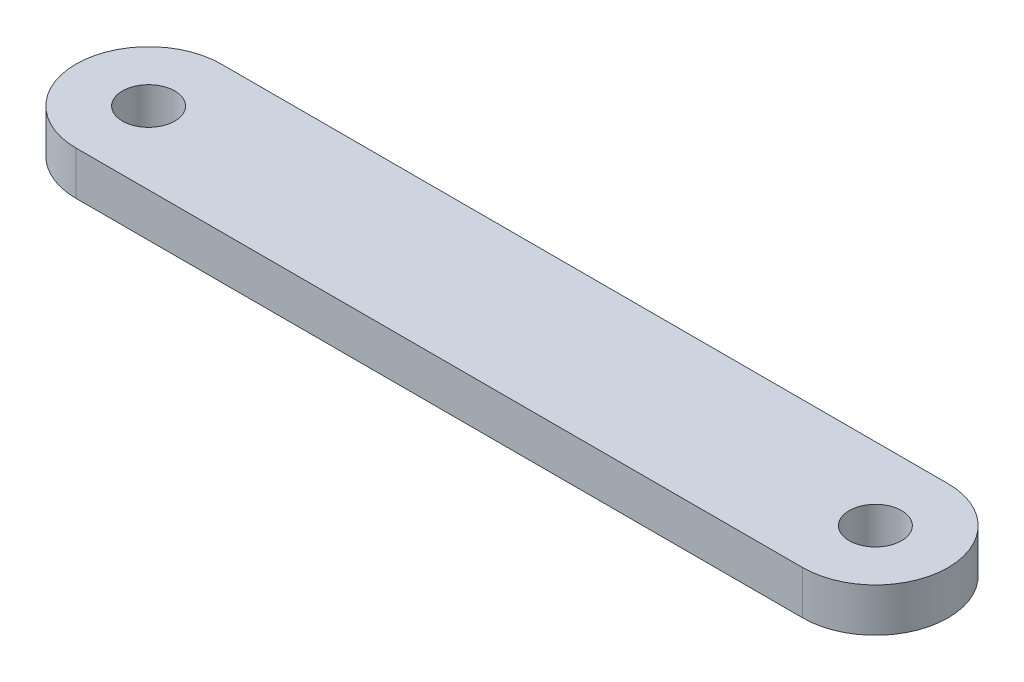
ISO-10303-21;
HEADER;
FILE_DESCRIPTION(('STEP AP214'),'2;1');
FILE_NAME('part.step','',(''),(''),'','','');
FILE_SCHEMA(('AUTOMOTIVE_DESIGN { 1 0 10303 214 1 1 1 1 }'));
ENDSEC;
DATA;
#1=APPLICATION_CONTEXT('core data for automotive mechanical design processes');
#2=APPLICATION_PROTOCOL_DEFINITION('international standard','automotive_design',2000,#1);
#3=PRODUCT_CONTEXT('',#1,'mechanical');
#4=PRODUCT('Part','Part','',(#3));
#5=PRODUCT_RELATED_PRODUCT_CATEGORY('part','',(#4));
#6=PRODUCT_DEFINITION_FORMATION('','',#4);
#7=PRODUCT_DEFINITION_CONTEXT('part definition',#1,'design');
#8=PRODUCT_DEFINITION('design','',#6,#7);
#9=PRODUCT_DEFINITION_SHAPE('','',#8);
#10=(LENGTH_UNIT() NAMED_UNIT(*) SI_UNIT(.MILLI.,.METRE.));
#11=(NAMED_UNIT(*) PLANE_ANGLE_UNIT() SI_UNIT($,.RADIAN.));
#12=(NAMED_UNIT(*) SI_UNIT($,.STERADIAN.) SOLID_ANGLE_UNIT());
#13=UNCERTAINTY_MEASURE_WITH_UNIT(LENGTH_MEASURE(1.E-05),#10,'distance_accuracy_value','');
#14=(GEOMETRIC_REPRESENTATION_CONTEXT(3) GLOBAL_UNCERTAINTY_ASSIGNED_CONTEXT((#13)) GLOBAL_UNIT_ASSIGNED_CONTEXT((#10,
#11,#12)) REPRESENTATION_CONTEXT('',''));
#15=CARTESIAN_POINT('',(0.,0.,0.));
#16=DIRECTION('',(0.,0.,1.));
#17=DIRECTION('',(1.,0.,0.));
#18=AXIS2_PLACEMENT_3D('',#15,#16,#17);
#19=CARTESIAN_POINT('',(0.,3.,0.));
#20=DIRECTION('',(0.,1.,0.));
#21=DIRECTION('',(0.,0.,1.));
#22=AXIS2_PLACEMENT_3D('',#19,#20,#21);
#23=PLANE('',#22);
#24=CARTESIAN_POINT('',(0.,3.,0.));
#25=DIRECTION('',(0.,1.,0.));
#26=DIRECTION('',(0.,0.,1.));
#27=AXIS2_PLACEMENT_3D('',#24,#25,#26);
#28=CIRCLE('',#27,1.8);
#29=CARTESIAN_POINT('',(0.,3.,1.8));
#30=VERTEX_POINT('',#29);
#31=EDGE_CURVE('E112',#30,#30,#28,.T.);
#32=ORIENTED_EDGE('',*,*,#31,.F.);
#33=EDGE_LOOP('',(#32));
#34=FACE_BOUND('',#33,.T.);
#35=CARTESIAN_POINT('',(0.,3.,0.));
#36=DIRECTION('',(0.,1.,0.));
#37=DIRECTION('',(0.,0.,1.));
#38=AXIS2_PLACEMENT_3D('',#35,#36,#37);
#39=CIRCLE('',#38,5.);
#40=CARTESIAN_POINT('',(0.,3.,-5.));
#41=VERTEX_POINT('',#40);
#42=CARTESIAN_POINT('',(0.,3.,5.));
#43=VERTEX_POINT('',#42);
#44=EDGE_CURVE('E92',#41,#43,#39,.T.);
#45=ORIENTED_EDGE('',*,*,#44,.T.);
#46=DIRECTION('',(1.,0.,0.));
#47=VECTOR('',#46,1.);
#48=CARTESIAN_POINT('',(0.,3.,5.));
#49=LINE('',#48,#47);
#50=CARTESIAN_POINT('',(50.,3.,5.));
#51=VERTEX_POINT('',#50);
#52=EDGE_CURVE('E87',#43,#51,#49,.T.);
#53=ORIENTED_EDGE('',*,*,#52,.T.);
#54=CARTESIAN_POINT('',(50.,3.,0.));
#55=DIRECTION('',(0.,1.,0.));
#56=DIRECTION('',(0.,0.,1.));
#57=AXIS2_PLACEMENT_3D('',#54,#55,#56);
#58=CIRCLE('',#57,5.);
#59=CARTESIAN_POINT('',(50.,3.,-5.));
#60=VERTEX_POINT('',#59);
#61=EDGE_CURVE('E90',#51,#60,#58,.T.);
#62=ORIENTED_EDGE('',*,*,#61,.T.);
#63=DIRECTION('',(-1.,0.,0.));
#64=VECTOR('',#63,1.);
#65=CARTESIAN_POINT('',(0.,3.,-5.));
#66=LINE('',#65,#64);
#67=EDGE_CURVE('E57',#60,#41,#66,.T.);
#68=ORIENTED_EDGE('',*,*,#67,.T.);
#69=EDGE_LOOP('',(#45,#53,#62,#68));
#70=FACE_BOUND('',#69,.T.);
#71=CARTESIAN_POINT('',(50.,3.,0.));
#72=DIRECTION('',(0.,1.,0.));
#73=DIRECTION('',(0.,0.,1.));
#74=AXIS2_PLACEMENT_3D('',#71,#72,#73);
#75=CIRCLE('',#74,1.8);
#76=CARTESIAN_POINT('',(50.,3.,1.8));
#77=VERTEX_POINT('',#76);
#78=EDGE_CURVE('E134',#77,#77,#75,.T.);
#79=ORIENTED_EDGE('',*,*,#78,.F.);
#80=EDGE_LOOP('',(#79));
#81=FACE_BOUND('',#80,.T.);
#82=ADVANCED_FACE('F39',(#34,#70,#81),#23,.T.);
#83=CARTESIAN_POINT('',(0.,0.,0.));
#84=DIRECTION('',(0.,1.,0.));
#85=DIRECTION('',(0.,0.,1.));
#86=AXIS2_PLACEMENT_3D('',#83,#84,#85);
#87=PLANE('',#86);
#88=CARTESIAN_POINT('',(0.,0.,0.));
#89=DIRECTION('',(0.,1.,0.));
#90=DIRECTION('',(0.,0.,1.));
#91=AXIS2_PLACEMENT_3D('',#88,#89,#90);
#92=CIRCLE('',#91,5.);
#93=CARTESIAN_POINT('',(0.,0.,-5.));
#94=VERTEX_POINT('',#93);
#95=CARTESIAN_POINT('',(0.,0.,5.));
#96=VERTEX_POINT('',#95);
#97=EDGE_CURVE('E108',#94,#96,#92,.T.);
#98=ORIENTED_EDGE('',*,*,#97,.F.);
#99=DIRECTION('',(-1.,0.,0.));
#100=VECTOR('',#99,1.);
#101=CARTESIAN_POINT('',(0.,0.,-5.));
#102=LINE('',#101,#100);
#103=CARTESIAN_POINT('',(50.,0.,-5.));
#104=VERTEX_POINT('',#103);
#105=EDGE_CURVE('E80',#104,#94,#102,.T.);
#106=ORIENTED_EDGE('',*,*,#105,.F.);
#107=CARTESIAN_POINT('',(50.,0.,0.));
#108=DIRECTION('',(0.,1.,0.));
#109=DIRECTION('',(0.,0.,1.));
#110=AXIS2_PLACEMENT_3D('',#107,#108,#109);
#111=CIRCLE('',#110,5.);
#112=CARTESIAN_POINT('',(50.,0.,5.));
#113=VERTEX_POINT('',#112);
#114=EDGE_CURVE('E74',#113,#104,#111,.T.);
#115=ORIENTED_EDGE('',*,*,#114,.F.);
#116=DIRECTION('',(1.,0.,0.));
#117=VECTOR('',#116,1.);
#118=CARTESIAN_POINT('',(0.,0.,5.));
#119=LINE('',#118,#117);
#120=EDGE_CURVE('E97',#96,#113,#119,.T.);
#121=ORIENTED_EDGE('',*,*,#120,.F.);
#122=EDGE_LOOP('',(#98,#106,#115,#121));
#123=FACE_BOUND('',#122,.T.);
#124=CARTESIAN_POINT('',(0.,0.,0.));
#125=DIRECTION('',(0.,1.,0.));
#126=DIRECTION('',(0.,0.,1.));
#127=AXIS2_PLACEMENT_3D('',#124,#125,#126);
#128=CIRCLE('',#127,1.8);
#129=CARTESIAN_POINT('',(0.,0.,1.8));
#130=VERTEX_POINT('',#129);
#131=EDGE_CURVE('E130',#130,#130,#128,.T.);
#132=ORIENTED_EDGE('',*,*,#131,.T.);
#133=EDGE_LOOP('',(#132));
#134=FACE_BOUND('',#133,.T.);
#135=CARTESIAN_POINT('',(50.,0.,0.));
#136=DIRECTION('',(0.,1.,0.));
#137=DIRECTION('',(0.,0.,1.));
#138=AXIS2_PLACEMENT_3D('',#135,#136,#137);
#139=CIRCLE('',#138,1.8);
#140=CARTESIAN_POINT('',(50.,0.,1.8));
#141=VERTEX_POINT('',#140);
#142=EDGE_CURVE('E138',#141,#141,#139,.T.);
#143=ORIENTED_EDGE('',*,*,#142,.T.);
#144=EDGE_LOOP('',(#143));
#145=FACE_BOUND('',#144,.T.);
#146=ADVANCED_FACE('F125',(#123,#134,#145),#87,.F.);
#147=CARTESIAN_POINT('',(0.,3.,0.));
#148=DIRECTION('',(0.,-1.,0.));
#149=DIRECTION('',(0.,0.,-1.));
#150=AXIS2_PLACEMENT_3D('',#147,#148,#149);
#151=CYLINDRICAL_SURFACE('',#150,5.);
#152=ORIENTED_EDGE('',*,*,#97,.T.);
#153=DIRECTION('',(0.,-1.,0.));
#154=VECTOR('',#153,1.);
#155=CARTESIAN_POINT('',(0.,3.,5.));
#156=LINE('',#155,#154);
#157=EDGE_CURVE('E11',#43,#96,#156,.T.);
#158=ORIENTED_EDGE('',*,*,#157,.F.);
#159=ORIENTED_EDGE('',*,*,#44,.F.);
#160=DIRECTION('',(0.,-1.,0.));
#161=VECTOR('',#160,1.);
#162=CARTESIAN_POINT('',(0.,3.,-5.));
#163=LINE('',#162,#161);
#164=EDGE_CURVE('E104',#41,#94,#163,.T.);
#165=ORIENTED_EDGE('',*,*,#164,.T.);
#166=EDGE_LOOP('',(#152,#158,#159,#165));
#167=FACE_BOUND('',#166,.T.);
#168=ADVANCED_FACE('F41',(#167),#151,.T.);
#169=CARTESIAN_POINT('',(0.,3.,5.));
#170=DIRECTION('',(0.,0.,-1.));
#171=DIRECTION('',(-1.,0.,0.));
#172=AXIS2_PLACEMENT_3D('',#169,#170,#171);
#173=PLANE('',#172);
#174=ORIENTED_EDGE('',*,*,#120,.T.);
#175=DIRECTION('',(0.,-1.,0.));
#176=VECTOR('',#175,1.);
#177=CARTESIAN_POINT('',(50.,3.,5.));
#178=LINE('',#177,#176);
#179=EDGE_CURVE('E49',#51,#113,#178,.T.);
#180=ORIENTED_EDGE('',*,*,#179,.F.);
#181=ORIENTED_EDGE('',*,*,#52,.F.);
#182=ORIENTED_EDGE('',*,*,#157,.T.);
#183=EDGE_LOOP('',(#174,#180,#181,#182));
#184=FACE_BOUND('',#183,.T.);
#185=ADVANCED_FACE('F96',(#184),#173,.F.);
#186=CARTESIAN_POINT('',(50.,3.,0.));
#187=DIRECTION('',(0.,-1.,0.));
#188=DIRECTION('',(0.,0.,-1.));
#189=AXIS2_PLACEMENT_3D('',#186,#187,#188);
#190=CYLINDRICAL_SURFACE('',#189,5.);
#191=ORIENTED_EDGE('',*,*,#114,.T.);
#192=DIRECTION('',(0.,-1.,0.));
#193=VECTOR('',#192,1.);
#194=CARTESIAN_POINT('',(50.,3.,-5.));
#195=LINE('',#194,#193);
#196=EDGE_CURVE('E99',#60,#104,#195,.T.);
#197=ORIENTED_EDGE('',*,*,#196,.F.);
#198=ORIENTED_EDGE('',*,*,#61,.F.);
#199=ORIENTED_EDGE('',*,*,#179,.T.);
#200=EDGE_LOOP('',(#191,#197,#198,#199));
#201=FACE_BOUND('',#200,.T.);
#202=ADVANCED_FACE('F100',(#201),#190,.T.);
#203=CARTESIAN_POINT('',(0.,3.,-5.));
#204=DIRECTION('',(0.,0.,1.));
#205=DIRECTION('',(1.,0.,0.));
#206=AXIS2_PLACEMENT_3D('',#203,#204,#205);
#207=PLANE('',#206);
#208=ORIENTED_EDGE('',*,*,#105,.T.);
#209=ORIENTED_EDGE('',*,*,#164,.F.);
#210=ORIENTED_EDGE('',*,*,#67,.F.);
#211=ORIENTED_EDGE('',*,*,#196,.T.);
#212=EDGE_LOOP('',(#208,#209,#210,#211));
#213=FACE_BOUND('',#212,.T.);
#214=ADVANCED_FACE('F122',(#213),#207,.F.);
#215=CARTESIAN_POINT('',(0.,3.,0.));
#216=DIRECTION('',(0.,-1.,0.));
#217=DIRECTION('',(0.,0.,-1.));
#218=AXIS2_PLACEMENT_3D('',#215,#216,#217);
#219=CYLINDRICAL_SURFACE('',#218,1.8);
#220=ORIENTED_EDGE('',*,*,#31,.T.);
#221=EDGE_LOOP('',(#220));
#222=FACE_BOUND('',#221,.T.);
#223=ORIENTED_EDGE('',*,*,#131,.F.);
#224=EDGE_LOOP('',(#223));
#225=FACE_BOUND('',#224,.T.);
#226=ADVANCED_FACE('F157',(#222,#225),#219,.F.);
#227=CARTESIAN_POINT('',(50.,3.,0.));
#228=DIRECTION('',(0.,-1.,0.));
#229=DIRECTION('',(0.,0.,-1.));
#230=AXIS2_PLACEMENT_3D('',#227,#228,#229);
#231=CYLINDRICAL_SURFACE('',#230,1.8);
#232=ORIENTED_EDGE('',*,*,#78,.T.);
#233=EDGE_LOOP('',(#232));
#234=FACE_BOUND('',#233,.T.);
#235=ORIENTED_EDGE('',*,*,#142,.F.);
#236=EDGE_LOOP('',(#235));
#237=FACE_BOUND('',#236,.T.);
#238=ADVANCED_FACE('F146',(#234,#237),#231,.F.);
#239=CLOSED_SHELL('',(#82,#146,#168,#185,#202,#214,#226,#238));
#240=MANIFOLD_SOLID_BREP('B2',#239);
#241=ADVANCED_BREP_SHAPE_REPRESENTATION('',(#18,#240),#14);
#242=SHAPE_DEFINITION_REPRESENTATION(#9,#241);
ENDSEC;
END-ISO-10303-21;
